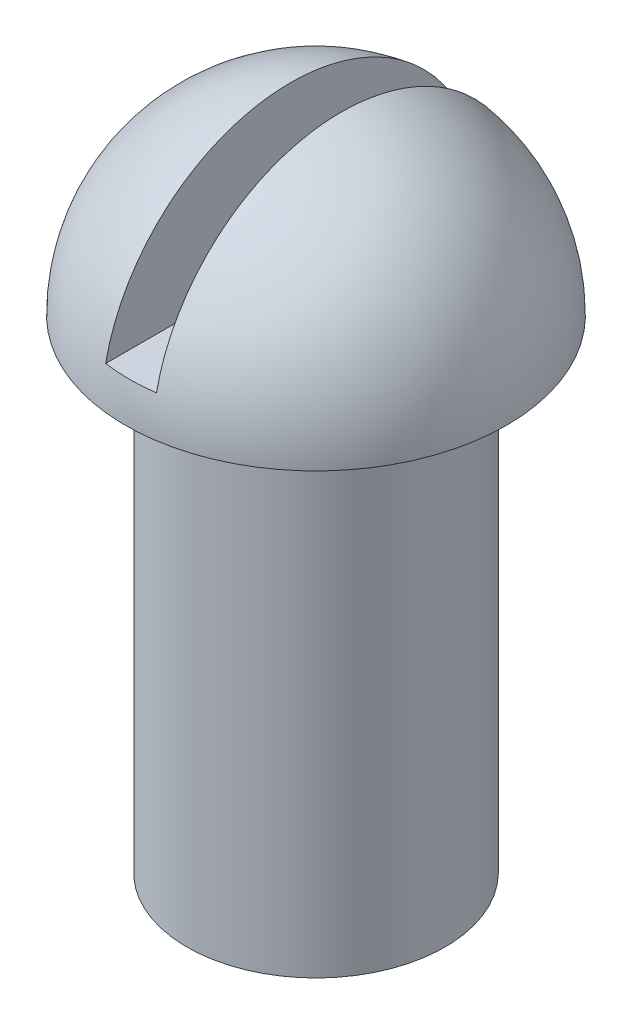
ISO-10303-21;
HEADER;
FILE_DESCRIPTION(('STEP AP214'),'2;1');
FILE_NAME('part.step','',(''),(''),'','','');
FILE_SCHEMA(('AUTOMOTIVE_DESIGN { 1 0 10303 214 1 1 1 1 }'));
ENDSEC;
DATA;
#1=APPLICATION_CONTEXT('core data for automotive mechanical design processes');
#2=APPLICATION_PROTOCOL_DEFINITION('international standard','automotive_design',2000,#1);
#3=PRODUCT_CONTEXT('',#1,'mechanical');
#4=PRODUCT('Part','Part','',(#3));
#5=PRODUCT_RELATED_PRODUCT_CATEGORY('part','',(#4));
#6=PRODUCT_DEFINITION_FORMATION('','',#4);
#7=PRODUCT_DEFINITION_CONTEXT('part definition',#1,'design');
#8=PRODUCT_DEFINITION('design','',#6,#7);
#9=PRODUCT_DEFINITION_SHAPE('','',#8);
#10=(LENGTH_UNIT() NAMED_UNIT(*) SI_UNIT(.MILLI.,.METRE.));
#11=(NAMED_UNIT(*) PLANE_ANGLE_UNIT() SI_UNIT($,.RADIAN.));
#12=(NAMED_UNIT(*) SI_UNIT($,.STERADIAN.) SOLID_ANGLE_UNIT());
#13=UNCERTAINTY_MEASURE_WITH_UNIT(LENGTH_MEASURE(1.E-05),#10,'distance_accuracy_value','');
#14=(GEOMETRIC_REPRESENTATION_CONTEXT(3) GLOBAL_UNCERTAINTY_ASSIGNED_CONTEXT((#13)) GLOBAL_UNIT_ASSIGNED_CONTEXT((#10,
#11,#12)) REPRESENTATION_CONTEXT('',''));
#15=CARTESIAN_POINT('',(0.,0.,0.));
#16=DIRECTION('',(0.,0.,1.));
#17=DIRECTION('',(1.,0.,0.));
#18=AXIS2_PLACEMENT_3D('',#15,#16,#17);
#19=CARTESIAN_POINT('',(0.,38.,0.));
#20=DIRECTION('',(0.,1.,0.));
#21=DIRECTION('',(1.,0.,0.));
#22=AXIS2_PLACEMENT_3D('',#19,#20,#21);
#23=SPHERICAL_SURFACE('',#22,15.);
#24=CARTESIAN_POINT('',(2.,38.,0.));
#25=DIRECTION('',(1.,0.,0.));
#26=DIRECTION('',(0.,1.,0.));
#27=AXIS2_PLACEMENT_3D('',#24,#25,#26);
#28=CIRCLE('',#27,14.8660687473185);
#29=CARTESIAN_POINT('',(2.,41.,-14.560219778561));
#30=VERTEX_POINT('',#29);
#31=CARTESIAN_POINT('',(2.,41.,14.560219778561));
#32=VERTEX_POINT('',#31);
#33=EDGE_CURVE('E75',#30,#32,#28,.T.);
#34=ORIENTED_EDGE('',*,*,#33,.T.);
#35=CARTESIAN_POINT('',(0.,41.,0.));
#36=DIRECTION('',(0.,-1.,0.));
#37=DIRECTION('',(0.,0.,-1.));
#38=AXIS2_PLACEMENT_3D('',#35,#36,#37);
#39=CIRCLE('',#38,14.6969384566991);
#40=CARTESIAN_POINT('',(-2.,41.,14.560219778561));
#41=VERTEX_POINT('',#40);
#42=EDGE_CURVE('E11',#32,#41,#39,.T.);
#43=ORIENTED_EDGE('',*,*,#42,.T.);
#44=CARTESIAN_POINT('',(-2.,38.,0.));
#45=DIRECTION('',(-1.,0.,0.));
#46=DIRECTION('',(0.,-1.,0.));
#47=AXIS2_PLACEMENT_3D('',#44,#45,#46);
#48=CIRCLE('',#47,14.8660687473185);
#49=CARTESIAN_POINT('',(-2.,41.,-14.560219778561));
#50=VERTEX_POINT('',#49);
#51=EDGE_CURVE('E45',#41,#50,#48,.T.);
#52=ORIENTED_EDGE('',*,*,#51,.T.);
#53=EDGE_CURVE('E48',#50,#30,#39,.T.);
#54=ORIENTED_EDGE('',*,*,#53,.T.);
#55=EDGE_LOOP('',(#34,#43,#52,#54));
#56=FACE_BOUND('',#55,.T.);
#57=CARTESIAN_POINT('',(0.,38.,0.));
#58=DIRECTION('',(0.,1.,0.));
#59=DIRECTION('',(-1.,0.,0.));
#60=AXIS2_PLACEMENT_3D('',#57,#58,#59);
#61=CIRCLE('',#60,15.);
#62=CARTESIAN_POINT('',(-15.,38.,0.));
#63=VERTEX_POINT('',#62);
#64=EDGE_CURVE('E77',#63,#63,#61,.T.);
#65=ORIENTED_EDGE('',*,*,#64,.T.);
#66=EDGE_LOOP('',(#65));
#67=FACE_BOUND('',#66,.T.);
#68=ADVANCED_FACE('F39',(#56,#67),#23,.T.);
#69=CARTESIAN_POINT('',(10.15,38.,0.));
#70=DIRECTION('',(0.,1.,0.));
#71=DIRECTION('',(-1.,0.,0.));
#72=AXIS2_PLACEMENT_3D('',#69,#70,#71);
#73=PLANE('',#72);
#74=ORIENTED_EDGE('',*,*,#64,.F.);
#75=EDGE_LOOP('',(#74));
#76=FACE_BOUND('',#75,.T.);
#77=CARTESIAN_POINT('',(0.,38.,0.));
#78=DIRECTION('',(0.,1.,0.));
#79=DIRECTION('',(-1.,0.,0.));
#80=AXIS2_PLACEMENT_3D('',#77,#78,#79);
#81=CIRCLE('',#80,10.15);
#82=CARTESIAN_POINT('',(-10.15,38.,0.));
#83=VERTEX_POINT('',#82);
#84=EDGE_CURVE('E83',#83,#83,#81,.T.);
#85=ORIENTED_EDGE('',*,*,#84,.T.);
#86=EDGE_LOOP('',(#85));
#87=FACE_BOUND('',#86,.T.);
#88=ADVANCED_FACE('F99',(#76,#87),#73,.F.);
#89=CARTESIAN_POINT('',(0.,53.,0.));
#90=DIRECTION('',(0.,1.,0.));
#91=DIRECTION('',(-1.,0.,0.));
#92=AXIS2_PLACEMENT_3D('',#89,#90,#91);
#93=CYLINDRICAL_SURFACE('',#92,10.15);
#94=ORIENTED_EDGE('',*,*,#84,.F.);
#95=EDGE_LOOP('',(#94));
#96=FACE_BOUND('',#95,.T.);
#97=CARTESIAN_POINT('',(0.,0.,0.));
#98=DIRECTION('',(0.,1.,0.));
#99=DIRECTION('',(-1.,0.,0.));
#100=AXIS2_PLACEMENT_3D('',#97,#98,#99);
#101=CIRCLE('',#100,10.15);
#102=CARTESIAN_POINT('',(-10.15,0.,0.));
#103=VERTEX_POINT('',#102);
#104=EDGE_CURVE('E72',#103,#103,#101,.T.);
#105=ORIENTED_EDGE('',*,*,#104,.T.);
#106=EDGE_LOOP('',(#105));
#107=FACE_BOUND('',#106,.T.);
#108=ADVANCED_FACE('F88',(#96,#107),#93,.T.);
#109=CARTESIAN_POINT('',(0.,0.,0.));
#110=DIRECTION('',(0.,1.,0.));
#111=DIRECTION('',(-1.,0.,0.));
#112=AXIS2_PLACEMENT_3D('',#109,#110,#111);
#113=PLANE('',#112);
#114=ORIENTED_EDGE('',*,*,#104,.F.);
#115=EDGE_LOOP('',(#114));
#116=FACE_BOUND('',#115,.T.);
#117=ADVANCED_FACE('F89',(#116),#113,.F.);
#118=CARTESIAN_POINT('',(-2.,60.7213254586723,-15.));
#119=DIRECTION('',(-1.,0.,0.));
#120=DIRECTION('',(0.,-1.,0.));
#121=AXIS2_PLACEMENT_3D('',#118,#119,#120);
#122=PLANE('',#121);
#123=DIRECTION('',(0.,0.,1.));
#124=VECTOR('',#123,1.);
#125=CARTESIAN_POINT('',(-2.,41.,-15.));
#126=LINE('',#125,#124);
#127=EDGE_CURVE('E70',#50,#41,#126,.T.);
#128=ORIENTED_EDGE('',*,*,#127,.F.);
#129=ORIENTED_EDGE('',*,*,#51,.F.);
#130=EDGE_LOOP('',(#128,#129));
#131=FACE_BOUND('',#130,.T.);
#132=ADVANCED_FACE('F95',(#131),#122,.F.);
#133=CARTESIAN_POINT('',(2.,60.7213254586723,-15.));
#134=DIRECTION('',(1.,0.,0.));
#135=DIRECTION('',(0.,1.,0.));
#136=AXIS2_PLACEMENT_3D('',#133,#134,#135);
#137=PLANE('',#136);
#138=DIRECTION('',(0.,0.,1.));
#139=VECTOR('',#138,1.);
#140=CARTESIAN_POINT('',(2.,41.,-15.));
#141=LINE('',#140,#139);
#142=EDGE_CURVE('E54',#30,#32,#141,.T.);
#143=ORIENTED_EDGE('',*,*,#142,.T.);
#144=ORIENTED_EDGE('',*,*,#33,.F.);
#145=EDGE_LOOP('',(#143,#144));
#146=FACE_BOUND('',#145,.T.);
#147=ADVANCED_FACE('F73',(#146),#137,.F.);
#148=CARTESIAN_POINT('',(-2.,41.,-15.));
#149=DIRECTION('',(0.,-1.,0.));
#150=DIRECTION('',(0.,0.,-1.));
#151=AXIS2_PLACEMENT_3D('',#148,#149,#150);
#152=PLANE('',#151);
#153=ORIENTED_EDGE('',*,*,#142,.F.);
#154=ORIENTED_EDGE('',*,*,#53,.F.);
#155=ORIENTED_EDGE('',*,*,#127,.T.);
#156=ORIENTED_EDGE('',*,*,#42,.F.);
#157=EDGE_LOOP('',(#153,#154,#155,#156));
#158=FACE_BOUND('',#157,.T.);
#159=ADVANCED_FACE('F67',(#158),#152,.F.);
#160=CLOSED_SHELL('',(#68,#88,#108,#117,#132,#147,#159));
#161=MANIFOLD_SOLID_BREP('B2',#160);
#162=ADVANCED_BREP_SHAPE_REPRESENTATION('',(#18,#161),#14);
#163=SHAPE_DEFINITION_REPRESENTATION(#9,#162);
ENDSEC;
END-ISO-10303-21;
